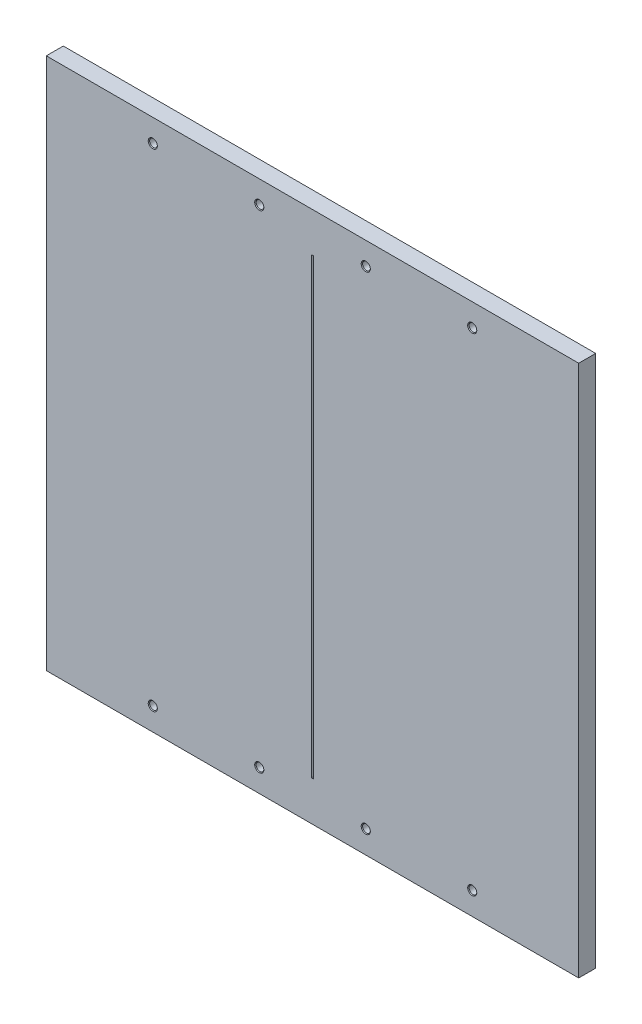
ISO-10303-21;
HEADER;
FILE_DESCRIPTION(('STEP AP214'),'2;1');
FILE_NAME('part.step','',(''),(''),'','','');
FILE_SCHEMA(('AUTOMOTIVE_DESIGN { 1 0 10303 214 1 1 1 1 }'));
ENDSEC;
DATA;
#1=APPLICATION_CONTEXT('core data for automotive mechanical design processes');
#2=APPLICATION_PROTOCOL_DEFINITION('international standard','automotive_design',2000,#1);
#3=PRODUCT_CONTEXT('',#1,'mechanical');
#4=PRODUCT('Part','Part','',(#3));
#5=PRODUCT_RELATED_PRODUCT_CATEGORY('part','',(#4));
#6=PRODUCT_DEFINITION_FORMATION('','',#4);
#7=PRODUCT_DEFINITION_CONTEXT('part definition',#1,'design');
#8=PRODUCT_DEFINITION('design','',#6,#7);
#9=PRODUCT_DEFINITION_SHAPE('','',#8);
#10=(LENGTH_UNIT() NAMED_UNIT(*) SI_UNIT(.MILLI.,.METRE.));
#11=(NAMED_UNIT(*) PLANE_ANGLE_UNIT() SI_UNIT($,.RADIAN.));
#12=(NAMED_UNIT(*) SI_UNIT($,.STERADIAN.) SOLID_ANGLE_UNIT());
#13=UNCERTAINTY_MEASURE_WITH_UNIT(LENGTH_MEASURE(1.E-05),#10,'distance_accuracy_value','');
#14=(GEOMETRIC_REPRESENTATION_CONTEXT(3) GLOBAL_UNCERTAINTY_ASSIGNED_CONTEXT((#13)) GLOBAL_UNIT_ASSIGNED_CONTEXT((#10,
#11,#12)) REPRESENTATION_CONTEXT('',''));
#15=CARTESIAN_POINT('',(0.,0.,0.));
#16=DIRECTION('',(0.,0.,1.));
#17=DIRECTION('',(1.,0.,0.));
#18=AXIS2_PLACEMENT_3D('',#15,#16,#17);
#19=CARTESIAN_POINT('',(235.,-235.,15.));
#20=DIRECTION('',(-1.,0.,0.));
#21=DIRECTION('',(0.,0.,1.));
#22=AXIS2_PLACEMENT_3D('',#19,#20,#21);
#23=PLANE('',#22);
#24=DIRECTION('',(0.,1.,0.));
#25=VECTOR('',#24,1.);
#26=CARTESIAN_POINT('',(235.,-235.,0.));
#27=LINE('',#26,#25);
#28=CARTESIAN_POINT('',(235.,-235.,0.));
#29=VERTEX_POINT('',#28);
#30=CARTESIAN_POINT('',(235.,235.,0.));
#31=VERTEX_POINT('',#30);
#32=EDGE_CURVE('E218',#29,#31,#27,.T.);
#33=ORIENTED_EDGE('',*,*,#32,.T.);
#34=DIRECTION('',(0.,0.,-1.));
#35=VECTOR('',#34,1.);
#36=CARTESIAN_POINT('',(235.,235.,15.));
#37=LINE('',#36,#35);
#38=CARTESIAN_POINT('',(235.,235.,15.));
#39=VERTEX_POINT('',#38);
#40=EDGE_CURVE('E11',#39,#31,#37,.T.);
#41=ORIENTED_EDGE('',*,*,#40,.F.);
#42=DIRECTION('',(0.,1.,0.));
#43=VECTOR('',#42,1.);
#44=CARTESIAN_POINT('',(235.,-235.,15.));
#45=LINE('',#44,#43);
#46=CARTESIAN_POINT('',(235.,-235.,15.));
#47=VERTEX_POINT('',#46);
#48=EDGE_CURVE('E211',#47,#39,#45,.T.);
#49=ORIENTED_EDGE('',*,*,#48,.F.);
#50=DIRECTION('',(0.,0.,-1.));
#51=VECTOR('',#50,1.);
#52=CARTESIAN_POINT('',(235.,-235.,15.));
#53=LINE('',#52,#51);
#54=EDGE_CURVE('E217',#47,#29,#53,.T.);
#55=ORIENTED_EDGE('',*,*,#54,.T.);
#56=EDGE_LOOP('',(#33,#41,#49,#55));
#57=FACE_BOUND('',#56,.T.);
#58=ADVANCED_FACE('F43',(#57),#23,.F.);
#59=CARTESIAN_POINT('',(-235.,235.,15.));
#60=DIRECTION('',(0.,-1.,0.));
#61=DIRECTION('',(0.,0.,-1.));
#62=AXIS2_PLACEMENT_3D('',#59,#60,#61);
#63=PLANE('',#62);
#64=DIRECTION('',(-1.,0.,0.));
#65=VECTOR('',#64,1.);
#66=CARTESIAN_POINT('',(-235.,235.,0.));
#67=LINE('',#66,#65);
#68=CARTESIAN_POINT('',(-235.,235.,0.));
#69=VERTEX_POINT('',#68);
#70=EDGE_CURVE('E221',#31,#69,#67,.T.);
#71=ORIENTED_EDGE('',*,*,#70,.T.);
#72=DIRECTION('',(0.,0.,-1.));
#73=VECTOR('',#72,1.);
#74=CARTESIAN_POINT('',(-235.,235.,15.));
#75=LINE('',#74,#73);
#76=CARTESIAN_POINT('',(-235.,235.,15.));
#77=VERTEX_POINT('',#76);
#78=EDGE_CURVE('E51',#77,#69,#75,.T.);
#79=ORIENTED_EDGE('',*,*,#78,.F.);
#80=DIRECTION('',(-1.,0.,0.));
#81=VECTOR('',#80,1.);
#82=CARTESIAN_POINT('',(-235.,235.,15.));
#83=LINE('',#82,#81);
#84=EDGE_CURVE('E96',#39,#77,#83,.T.);
#85=ORIENTED_EDGE('',*,*,#84,.F.);
#86=ORIENTED_EDGE('',*,*,#40,.T.);
#87=EDGE_LOOP('',(#71,#79,#85,#86));
#88=FACE_BOUND('',#87,.T.);
#89=ADVANCED_FACE('F277',(#88),#63,.F.);
#90=CARTESIAN_POINT('',(-235.,-235.,15.));
#91=DIRECTION('',(1.,0.,0.));
#92=DIRECTION('',(0.,0.,-1.));
#93=AXIS2_PLACEMENT_3D('',#90,#91,#92);
#94=PLANE('',#93);
#95=DIRECTION('',(0.,-1.,0.));
#96=VECTOR('',#95,1.);
#97=CARTESIAN_POINT('',(-235.,-235.,0.));
#98=LINE('',#97,#96);
#99=CARTESIAN_POINT('',(-235.,-235.,0.));
#100=VERTEX_POINT('',#99);
#101=EDGE_CURVE('E223',#69,#100,#98,.T.);
#102=ORIENTED_EDGE('',*,*,#101,.T.);
#103=DIRECTION('',(0.,0.,-1.));
#104=VECTOR('',#103,1.);
#105=CARTESIAN_POINT('',(-235.,-235.,15.));
#106=LINE('',#105,#104);
#107=CARTESIAN_POINT('',(-235.,-235.,15.));
#108=VERTEX_POINT('',#107);
#109=EDGE_CURVE('E227',#108,#100,#106,.T.);
#110=ORIENTED_EDGE('',*,*,#109,.F.);
#111=DIRECTION('',(0.,-1.,0.));
#112=VECTOR('',#111,1.);
#113=CARTESIAN_POINT('',(-235.,-235.,15.));
#114=LINE('',#113,#112);
#115=EDGE_CURVE('E214',#77,#108,#114,.T.);
#116=ORIENTED_EDGE('',*,*,#115,.F.);
#117=ORIENTED_EDGE('',*,*,#78,.T.);
#118=EDGE_LOOP('',(#102,#110,#116,#117));
#119=FACE_BOUND('',#118,.T.);
#120=ADVANCED_FACE('F276',(#119),#94,.F.);
#121=CARTESIAN_POINT('',(-235.,-235.,15.));
#122=DIRECTION('',(0.,1.,0.));
#123=DIRECTION('',(0.,0.,1.));
#124=AXIS2_PLACEMENT_3D('',#121,#122,#123);
#125=PLANE('',#124);
#126=DIRECTION('',(1.,0.,0.));
#127=VECTOR('',#126,1.);
#128=CARTESIAN_POINT('',(-235.,-235.,0.));
#129=LINE('',#128,#127);
#130=EDGE_CURVE('E89',#100,#29,#129,.T.);
#131=ORIENTED_EDGE('',*,*,#130,.T.);
#132=ORIENTED_EDGE('',*,*,#54,.F.);
#133=DIRECTION('',(1.,0.,0.));
#134=VECTOR('',#133,1.);
#135=CARTESIAN_POINT('',(-235.,-235.,15.));
#136=LINE('',#135,#134);
#137=EDGE_CURVE('E68',#108,#47,#136,.T.);
#138=ORIENTED_EDGE('',*,*,#137,.F.);
#139=ORIENTED_EDGE('',*,*,#109,.T.);
#140=EDGE_LOOP('',(#131,#132,#138,#139));
#141=FACE_BOUND('',#140,.T.);
#142=ADVANCED_FACE('F272',(#141),#125,.F.);
#143=CARTESIAN_POINT('',(0.,0.,15.));
#144=DIRECTION('',(0.,0.,-1.));
#145=DIRECTION('',(-1.,0.,0.));
#146=AXIS2_PLACEMENT_3D('',#143,#144,#145);
#147=PLANE('',#146);
#148=DIRECTION('',(-1.,0.,0.));
#149=VECTOR('',#148,1.);
#150=CARTESIAN_POINT('',(-1.00000000000002,200.,15.));
#151=LINE('',#150,#149);
#152=CARTESIAN_POINT('',(0.999999999999976,200.,15.));
#153=VERTEX_POINT('',#152);
#154=CARTESIAN_POINT('',(-1.00000000000002,200.,15.));
#155=VERTEX_POINT('',#154);
#156=EDGE_CURVE('E147',#153,#155,#151,.T.);
#157=ORIENTED_EDGE('',*,*,#156,.F.);
#158=DIRECTION('',(0.,1.,0.));
#159=VECTOR('',#158,1.);
#160=CARTESIAN_POINT('',(0.999999999999976,200.,15.));
#161=LINE('',#160,#159);
#162=CARTESIAN_POINT('',(1.00000000000002,-200.,15.));
#163=VERTEX_POINT('',#162);
#164=EDGE_CURVE('E59',#163,#153,#161,.T.);
#165=ORIENTED_EDGE('',*,*,#164,.F.);
#166=DIRECTION('',(1.,0.,0.));
#167=VECTOR('',#166,1.);
#168=CARTESIAN_POINT('',(-0.999999999999975,-200.,15.));
#169=LINE('',#168,#167);
#170=CARTESIAN_POINT('',(-0.999999999999975,-200.,15.));
#171=VERTEX_POINT('',#170);
#172=EDGE_CURVE('E138',#171,#163,#169,.T.);
#173=ORIENTED_EDGE('',*,*,#172,.F.);
#174=DIRECTION('',(0.,-1.,0.));
#175=VECTOR('',#174,1.);
#176=CARTESIAN_POINT('',(-1.00000000000002,200.,15.));
#177=LINE('',#176,#175);
#178=EDGE_CURVE('E141',#155,#171,#177,.T.);
#179=ORIENTED_EDGE('',*,*,#178,.F.);
#180=EDGE_LOOP('',(#157,#165,#173,#179));
#181=FACE_BOUND('',#180,.T.);
#182=CARTESIAN_POINT('',(-141.,215.,15.));
#183=DIRECTION('',(0.,0.,1.));
#184=DIRECTION('',(1.,0.,0.));
#185=AXIS2_PLACEMENT_3D('',#182,#183,#184);
#186=CIRCLE('',#185,4.025);
#187=CARTESIAN_POINT('',(-136.975,215.,15.));
#188=VERTEX_POINT('',#187);
#189=EDGE_CURVE('E153',#188,#188,#186,.T.);
#190=ORIENTED_EDGE('',*,*,#189,.F.);
#191=EDGE_LOOP('',(#190));
#192=FACE_BOUND('',#191,.T.);
#193=CARTESIAN_POINT('',(-46.9999999999999,215.,15.));
#194=DIRECTION('',(0.,0.,1.));
#195=DIRECTION('',(1.,0.,0.));
#196=AXIS2_PLACEMENT_3D('',#193,#194,#195);
#197=CIRCLE('',#196,4.025);
#198=CARTESIAN_POINT('',(-42.9749999999999,215.,15.));
#199=VERTEX_POINT('',#198);
#200=EDGE_CURVE('E162',#199,#199,#197,.T.);
#201=ORIENTED_EDGE('',*,*,#200,.F.);
#202=EDGE_LOOP('',(#201));
#203=FACE_BOUND('',#202,.T.);
#204=CARTESIAN_POINT('',(47.0000000000001,215.,15.));
#205=DIRECTION('',(0.,0.,1.));
#206=DIRECTION('',(1.,0.,0.));
#207=AXIS2_PLACEMENT_3D('',#204,#205,#206);
#208=CIRCLE('',#207,4.025);
#209=CARTESIAN_POINT('',(51.0250000000001,215.,15.));
#210=VERTEX_POINT('',#209);
#211=EDGE_CURVE('E169',#210,#210,#208,.T.);
#212=ORIENTED_EDGE('',*,*,#211,.F.);
#213=EDGE_LOOP('',(#212));
#214=FACE_BOUND('',#213,.T.);
#215=CARTESIAN_POINT('',(141.,215.,15.));
#216=DIRECTION('',(0.,0.,1.));
#217=DIRECTION('',(1.,0.,0.));
#218=AXIS2_PLACEMENT_3D('',#215,#216,#217);
#219=CIRCLE('',#218,4.025);
#220=CARTESIAN_POINT('',(145.025,215.,15.));
#221=VERTEX_POINT('',#220);
#222=EDGE_CURVE('E176',#221,#221,#219,.T.);
#223=ORIENTED_EDGE('',*,*,#222,.F.);
#224=EDGE_LOOP('',(#223));
#225=FACE_BOUND('',#224,.T.);
#226=CARTESIAN_POINT('',(-141.,-215.,15.));
#227=DIRECTION('',(0.,0.,1.));
#228=DIRECTION('',(1.,0.,0.));
#229=AXIS2_PLACEMENT_3D('',#226,#227,#228);
#230=CIRCLE('',#229,4.025);
#231=CARTESIAN_POINT('',(-136.975,-215.,15.));
#232=VERTEX_POINT('',#231);
#233=EDGE_CURVE('E183',#232,#232,#230,.T.);
#234=ORIENTED_EDGE('',*,*,#233,.F.);
#235=EDGE_LOOP('',(#234));
#236=FACE_BOUND('',#235,.T.);
#237=CARTESIAN_POINT('',(-46.9999999999999,-215.,15.));
#238=DIRECTION('',(0.,0.,1.));
#239=DIRECTION('',(1.,0.,0.));
#240=AXIS2_PLACEMENT_3D('',#237,#238,#239);
#241=CIRCLE('',#240,4.025);
#242=CARTESIAN_POINT('',(-42.9749999999998,-215.,15.));
#243=VERTEX_POINT('',#242);
#244=EDGE_CURVE('E190',#243,#243,#241,.T.);
#245=ORIENTED_EDGE('',*,*,#244,.F.);
#246=EDGE_LOOP('',(#245));
#247=FACE_BOUND('',#246,.T.);
#248=CARTESIAN_POINT('',(141.,-215.,15.));
#249=DIRECTION('',(0.,0.,1.));
#250=DIRECTION('',(1.,0.,0.));
#251=AXIS2_PLACEMENT_3D('',#248,#249,#250);
#252=CIRCLE('',#251,4.025);
#253=CARTESIAN_POINT('',(145.025,-215.,15.));
#254=VERTEX_POINT('',#253);
#255=EDGE_CURVE('E197',#254,#254,#252,.T.);
#256=ORIENTED_EDGE('',*,*,#255,.F.);
#257=EDGE_LOOP('',(#256));
#258=FACE_BOUND('',#257,.T.);
#259=CARTESIAN_POINT('',(47.0000000000001,-215.,15.));
#260=DIRECTION('',(0.,0.,1.));
#261=DIRECTION('',(1.,0.,0.));
#262=AXIS2_PLACEMENT_3D('',#259,#260,#261);
#263=CIRCLE('',#262,4.025);
#264=CARTESIAN_POINT('',(51.0250000000001,-215.,15.));
#265=VERTEX_POINT('',#264);
#266=EDGE_CURVE('E204',#265,#265,#263,.T.);
#267=ORIENTED_EDGE('',*,*,#266,.F.);
#268=EDGE_LOOP('',(#267));
#269=FACE_BOUND('',#268,.T.);
#270=ORIENTED_EDGE('',*,*,#48,.T.);
#271=ORIENTED_EDGE('',*,*,#84,.T.);
#272=ORIENTED_EDGE('',*,*,#115,.T.);
#273=ORIENTED_EDGE('',*,*,#137,.T.);
#274=EDGE_LOOP('',(#270,#271,#272,#273));
#275=FACE_BOUND('',#274,.T.);
#276=ADVANCED_FACE('F252',(#181,#192,#203,#214,#225,#236,#247,#258,#269,#275),#147,.F.);
#277=CARTESIAN_POINT('',(0.,0.,0.));
#278=DIRECTION('',(0.,0.,-1.));
#279=DIRECTION('',(-1.,0.,0.));
#280=AXIS2_PLACEMENT_3D('',#277,#278,#279);
#281=PLANE('',#280);
#282=CARTESIAN_POINT('',(-141.,215.,0.));
#283=DIRECTION('',(0.,0.,-1.));
#284=DIRECTION('',(-1.,0.,0.));
#285=AXIS2_PLACEMENT_3D('',#282,#283,#284);
#286=CIRCLE('',#285,3.39999999999999);
#287=CARTESIAN_POINT('',(-144.4,215.,0.));
#288=VERTEX_POINT('',#287);
#289=EDGE_CURVE('E46',#288,#288,#286,.T.);
#290=ORIENTED_EDGE('',*,*,#289,.F.);
#291=EDGE_LOOP('',(#290));
#292=FACE_BOUND('',#291,.T.);
#293=CARTESIAN_POINT('',(-46.9999999999999,215.,0.));
#294=DIRECTION('',(0.,0.,-1.));
#295=DIRECTION('',(-1.,0.,0.));
#296=AXIS2_PLACEMENT_3D('',#293,#294,#295);
#297=CIRCLE('',#296,3.4);
#298=CARTESIAN_POINT('',(-50.3999999999999,215.,0.));
#299=VERTEX_POINT('',#298);
#300=EDGE_CURVE('E168',#299,#299,#297,.T.);
#301=ORIENTED_EDGE('',*,*,#300,.F.);
#302=EDGE_LOOP('',(#301));
#303=FACE_BOUND('',#302,.T.);
#304=CARTESIAN_POINT('',(47.0000000000001,215.,0.));
#305=DIRECTION('',(0.,0.,-1.));
#306=DIRECTION('',(-1.,0.,0.));
#307=AXIS2_PLACEMENT_3D('',#304,#305,#306);
#308=CIRCLE('',#307,3.4);
#309=CARTESIAN_POINT('',(43.6000000000001,215.,0.));
#310=VERTEX_POINT('',#309);
#311=EDGE_CURVE('E175',#310,#310,#308,.T.);
#312=ORIENTED_EDGE('',*,*,#311,.F.);
#313=EDGE_LOOP('',(#312));
#314=FACE_BOUND('',#313,.T.);
#315=CARTESIAN_POINT('',(141.,215.,0.));
#316=DIRECTION('',(0.,0.,-1.));
#317=DIRECTION('',(-1.,0.,0.));
#318=AXIS2_PLACEMENT_3D('',#315,#316,#317);
#319=CIRCLE('',#318,3.39999999999999);
#320=CARTESIAN_POINT('',(137.6,215.,0.));
#321=VERTEX_POINT('',#320);
#322=EDGE_CURVE('E182',#321,#321,#319,.T.);
#323=ORIENTED_EDGE('',*,*,#322,.F.);
#324=EDGE_LOOP('',(#323));
#325=FACE_BOUND('',#324,.T.);
#326=CARTESIAN_POINT('',(-141.,-215.,0.));
#327=DIRECTION('',(0.,0.,-1.));
#328=DIRECTION('',(-1.,0.,0.));
#329=AXIS2_PLACEMENT_3D('',#326,#327,#328);
#330=CIRCLE('',#329,3.39999999999999);
#331=CARTESIAN_POINT('',(-144.4,-215.,0.));
#332=VERTEX_POINT('',#331);
#333=EDGE_CURVE('E189',#332,#332,#330,.T.);
#334=ORIENTED_EDGE('',*,*,#333,.F.);
#335=EDGE_LOOP('',(#334));
#336=FACE_BOUND('',#335,.T.);
#337=CARTESIAN_POINT('',(-46.9999999999999,-215.,0.));
#338=DIRECTION('',(0.,0.,-1.));
#339=DIRECTION('',(-1.,0.,0.));
#340=AXIS2_PLACEMENT_3D('',#337,#338,#339);
#341=CIRCLE('',#340,3.4);
#342=CARTESIAN_POINT('',(-50.3999999999998,-215.,0.));
#343=VERTEX_POINT('',#342);
#344=EDGE_CURVE('E196',#343,#343,#341,.T.);
#345=ORIENTED_EDGE('',*,*,#344,.F.);
#346=EDGE_LOOP('',(#345));
#347=FACE_BOUND('',#346,.T.);
#348=CARTESIAN_POINT('',(141.,-215.,0.));
#349=DIRECTION('',(0.,0.,-1.));
#350=DIRECTION('',(-1.,0.,0.));
#351=AXIS2_PLACEMENT_3D('',#348,#349,#350);
#352=CIRCLE('',#351,3.39999999999999);
#353=CARTESIAN_POINT('',(137.6,-215.,0.));
#354=VERTEX_POINT('',#353);
#355=EDGE_CURVE('E203',#354,#354,#352,.T.);
#356=ORIENTED_EDGE('',*,*,#355,.F.);
#357=EDGE_LOOP('',(#356));
#358=FACE_BOUND('',#357,.T.);
#359=CARTESIAN_POINT('',(47.0000000000001,-215.,0.));
#360=DIRECTION('',(0.,0.,-1.));
#361=DIRECTION('',(-1.,0.,0.));
#362=AXIS2_PLACEMENT_3D('',#359,#360,#361);
#363=CIRCLE('',#362,3.4);
#364=CARTESIAN_POINT('',(43.6000000000001,-215.,0.));
#365=VERTEX_POINT('',#364);
#366=EDGE_CURVE('E210',#365,#365,#363,.T.);
#367=ORIENTED_EDGE('',*,*,#366,.F.);
#368=EDGE_LOOP('',(#367));
#369=FACE_BOUND('',#368,.T.);
#370=ORIENTED_EDGE('',*,*,#32,.F.);
#371=ORIENTED_EDGE('',*,*,#130,.F.);
#372=ORIENTED_EDGE('',*,*,#101,.F.);
#373=ORIENTED_EDGE('',*,*,#70,.F.);
#374=EDGE_LOOP('',(#370,#371,#372,#373));
#375=FACE_BOUND('',#374,.T.);
#376=ADVANCED_FACE('F248',(#292,#303,#314,#325,#336,#347,#358,#369,#375),#281,.T.);
#377=CARTESIAN_POINT('',(47.0000000000001,-215.,15.));
#378=DIRECTION('',(0.,0.,1.));
#379=DIRECTION('',(1.,0.,0.));
#380=AXIS2_PLACEMENT_3D('',#377,#378,#379);
#381=CYLINDRICAL_SURFACE('',#380,3.4);
#382=ORIENTED_EDGE('',*,*,#366,.T.);
#383=EDGE_LOOP('',(#382));
#384=FACE_BOUND('',#383,.T.);
#385=CARTESIAN_POINT('',(47.0000000000001,-215.,14.375));
#386=DIRECTION('',(0.,0.,1.));
#387=DIRECTION('',(1.,0.,0.));
#388=AXIS2_PLACEMENT_3D('',#385,#386,#387);
#389=CIRCLE('',#388,3.4);
#390=CARTESIAN_POINT('',(50.4000000000001,-215.,14.375));
#391=VERTEX_POINT('',#390);
#392=EDGE_CURVE('E207',#391,#391,#389,.T.);
#393=ORIENTED_EDGE('',*,*,#392,.T.);
#394=EDGE_LOOP('',(#393));
#395=FACE_BOUND('',#394,.T.);
#396=ADVANCED_FACE('F251',(#384,#395),#381,.F.);
#397=CARTESIAN_POINT('',(47.0000000000001,-215.,15.));
#398=DIRECTION('',(0.,0.,1.));
#399=DIRECTION('',(1.,0.,0.));
#400=AXIS2_PLACEMENT_3D('',#397,#398,#399);
#401=CONICAL_SURFACE('',#400,4.025,0.785398163397446);
#402=ORIENTED_EDGE('',*,*,#392,.F.);
#403=EDGE_LOOP('',(#402));
#404=FACE_BOUND('',#403,.T.);
#405=ORIENTED_EDGE('',*,*,#266,.T.);
#406=EDGE_LOOP('',(#405));
#407=FACE_BOUND('',#406,.T.);
#408=ADVANCED_FACE('F292',(#404,#407),#401,.F.);
#409=CARTESIAN_POINT('',(141.,-215.,15.));
#410=DIRECTION('',(0.,0.,1.));
#411=DIRECTION('',(1.,0.,0.));
#412=AXIS2_PLACEMENT_3D('',#409,#410,#411);
#413=CYLINDRICAL_SURFACE('',#412,3.39999999999999);
#414=ORIENTED_EDGE('',*,*,#355,.T.);
#415=EDGE_LOOP('',(#414));
#416=FACE_BOUND('',#415,.T.);
#417=CARTESIAN_POINT('',(141.,-215.,14.375));
#418=DIRECTION('',(0.,0.,1.));
#419=DIRECTION('',(1.,0.,0.));
#420=AXIS2_PLACEMENT_3D('',#417,#418,#419);
#421=CIRCLE('',#420,3.39999999999999);
#422=CARTESIAN_POINT('',(144.4,-215.,14.375));
#423=VERTEX_POINT('',#422);
#424=EDGE_CURVE('E200',#423,#423,#421,.T.);
#425=ORIENTED_EDGE('',*,*,#424,.T.);
#426=EDGE_LOOP('',(#425));
#427=FACE_BOUND('',#426,.T.);
#428=ADVANCED_FACE('F296',(#416,#427),#413,.F.);
#429=CARTESIAN_POINT('',(141.,-215.,15.));
#430=DIRECTION('',(0.,0.,1.));
#431=DIRECTION('',(1.,0.,0.));
#432=AXIS2_PLACEMENT_3D('',#429,#430,#431);
#433=CONICAL_SURFACE('',#432,4.025,0.785398163397457);
#434=ORIENTED_EDGE('',*,*,#424,.F.);
#435=EDGE_LOOP('',(#434));
#436=FACE_BOUND('',#435,.T.);
#437=ORIENTED_EDGE('',*,*,#255,.T.);
#438=EDGE_LOOP('',(#437));
#439=FACE_BOUND('',#438,.T.);
#440=ADVANCED_FACE('F300',(#436,#439),#433,.F.);
#441=CARTESIAN_POINT('',(-46.9999999999999,-215.,15.));
#442=DIRECTION('',(0.,0.,1.));
#443=DIRECTION('',(1.,0.,0.));
#444=AXIS2_PLACEMENT_3D('',#441,#442,#443);
#445=CYLINDRICAL_SURFACE('',#444,3.4);
#446=ORIENTED_EDGE('',*,*,#344,.T.);
#447=EDGE_LOOP('',(#446));
#448=FACE_BOUND('',#447,.T.);
#449=CARTESIAN_POINT('',(-46.9999999999999,-215.,14.375));
#450=DIRECTION('',(0.,0.,1.));
#451=DIRECTION('',(1.,0.,0.));
#452=AXIS2_PLACEMENT_3D('',#449,#450,#451);
#453=CIRCLE('',#452,3.4);
#454=CARTESIAN_POINT('',(-43.5999999999998,-215.,14.375));
#455=VERTEX_POINT('',#454);
#456=EDGE_CURVE('E193',#455,#455,#453,.T.);
#457=ORIENTED_EDGE('',*,*,#456,.T.);
#458=EDGE_LOOP('',(#457));
#459=FACE_BOUND('',#458,.T.);
#460=ADVANCED_FACE('F304',(#448,#459),#445,.F.);
#461=CARTESIAN_POINT('',(-46.9999999999999,-215.,15.));
#462=DIRECTION('',(0.,0.,1.));
#463=DIRECTION('',(1.,0.,0.));
#464=AXIS2_PLACEMENT_3D('',#461,#462,#463);
#465=CONICAL_SURFACE('',#464,4.025,0.785398163397446);
#466=ORIENTED_EDGE('',*,*,#456,.F.);
#467=EDGE_LOOP('',(#466));
#468=FACE_BOUND('',#467,.T.);
#469=ORIENTED_EDGE('',*,*,#244,.T.);
#470=EDGE_LOOP('',(#469));
#471=FACE_BOUND('',#470,.T.);
#472=ADVANCED_FACE('F308',(#468,#471),#465,.F.);
#473=CARTESIAN_POINT('',(-141.,-215.,15.));
#474=DIRECTION('',(0.,0.,1.));
#475=DIRECTION('',(1.,0.,0.));
#476=AXIS2_PLACEMENT_3D('',#473,#474,#475);
#477=CYLINDRICAL_SURFACE('',#476,3.39999999999999);
#478=ORIENTED_EDGE('',*,*,#333,.T.);
#479=EDGE_LOOP('',(#478));
#480=FACE_BOUND('',#479,.T.);
#481=CARTESIAN_POINT('',(-141.,-215.,14.375));
#482=DIRECTION('',(0.,0.,1.));
#483=DIRECTION('',(1.,0.,0.));
#484=AXIS2_PLACEMENT_3D('',#481,#482,#483);
#485=CIRCLE('',#484,3.39999999999999);
#486=CARTESIAN_POINT('',(-137.6,-215.,14.375));
#487=VERTEX_POINT('',#486);
#488=EDGE_CURVE('E186',#487,#487,#485,.T.);
#489=ORIENTED_EDGE('',*,*,#488,.T.);
#490=EDGE_LOOP('',(#489));
#491=FACE_BOUND('',#490,.T.);
#492=ADVANCED_FACE('F312',(#480,#491),#477,.F.);
#493=CARTESIAN_POINT('',(-141.,-215.,15.));
#494=DIRECTION('',(0.,0.,1.));
#495=DIRECTION('',(1.,0.,0.));
#496=AXIS2_PLACEMENT_3D('',#493,#494,#495);
#497=CONICAL_SURFACE('',#496,4.025,0.785398163397457);
#498=ORIENTED_EDGE('',*,*,#488,.F.);
#499=EDGE_LOOP('',(#498));
#500=FACE_BOUND('',#499,.T.);
#501=ORIENTED_EDGE('',*,*,#233,.T.);
#502=EDGE_LOOP('',(#501));
#503=FACE_BOUND('',#502,.T.);
#504=ADVANCED_FACE('F316',(#500,#503),#497,.F.);
#505=CARTESIAN_POINT('',(141.,215.,15.));
#506=DIRECTION('',(0.,0.,1.));
#507=DIRECTION('',(1.,0.,0.));
#508=AXIS2_PLACEMENT_3D('',#505,#506,#507);
#509=CYLINDRICAL_SURFACE('',#508,3.39999999999999);
#510=ORIENTED_EDGE('',*,*,#322,.T.);
#511=EDGE_LOOP('',(#510));
#512=FACE_BOUND('',#511,.T.);
#513=CARTESIAN_POINT('',(141.,215.,14.375));
#514=DIRECTION('',(0.,0.,1.));
#515=DIRECTION('',(1.,0.,0.));
#516=AXIS2_PLACEMENT_3D('',#513,#514,#515);
#517=CIRCLE('',#516,3.39999999999999);
#518=CARTESIAN_POINT('',(144.4,215.,14.375));
#519=VERTEX_POINT('',#518);
#520=EDGE_CURVE('E179',#519,#519,#517,.T.);
#521=ORIENTED_EDGE('',*,*,#520,.T.);
#522=EDGE_LOOP('',(#521));
#523=FACE_BOUND('',#522,.T.);
#524=ADVANCED_FACE('F320',(#512,#523),#509,.F.);
#525=CARTESIAN_POINT('',(141.,215.,15.));
#526=DIRECTION('',(0.,0.,1.));
#527=DIRECTION('',(1.,0.,0.));
#528=AXIS2_PLACEMENT_3D('',#525,#526,#527);
#529=CONICAL_SURFACE('',#528,4.025,0.785398163397457);
#530=ORIENTED_EDGE('',*,*,#520,.F.);
#531=EDGE_LOOP('',(#530));
#532=FACE_BOUND('',#531,.T.);
#533=ORIENTED_EDGE('',*,*,#222,.T.);
#534=EDGE_LOOP('',(#533));
#535=FACE_BOUND('',#534,.T.);
#536=ADVANCED_FACE('F324',(#532,#535),#529,.F.);
#537=CARTESIAN_POINT('',(47.0000000000001,215.,15.));
#538=DIRECTION('',(0.,0.,1.));
#539=DIRECTION('',(1.,0.,0.));
#540=AXIS2_PLACEMENT_3D('',#537,#538,#539);
#541=CYLINDRICAL_SURFACE('',#540,3.4);
#542=ORIENTED_EDGE('',*,*,#311,.T.);
#543=EDGE_LOOP('',(#542));
#544=FACE_BOUND('',#543,.T.);
#545=CARTESIAN_POINT('',(47.0000000000001,215.,14.375));
#546=DIRECTION('',(0.,0.,1.));
#547=DIRECTION('',(1.,0.,0.));
#548=AXIS2_PLACEMENT_3D('',#545,#546,#547);
#549=CIRCLE('',#548,3.4);
#550=CARTESIAN_POINT('',(50.4000000000001,215.,14.375));
#551=VERTEX_POINT('',#550);
#552=EDGE_CURVE('E172',#551,#551,#549,.T.);
#553=ORIENTED_EDGE('',*,*,#552,.T.);
#554=EDGE_LOOP('',(#553));
#555=FACE_BOUND('',#554,.T.);
#556=ADVANCED_FACE('F328',(#544,#555),#541,.F.);
#557=CARTESIAN_POINT('',(47.0000000000001,215.,15.));
#558=DIRECTION('',(0.,0.,1.));
#559=DIRECTION('',(1.,0.,0.));
#560=AXIS2_PLACEMENT_3D('',#557,#558,#559);
#561=CONICAL_SURFACE('',#560,4.025,0.785398163397446);
#562=ORIENTED_EDGE('',*,*,#552,.F.);
#563=EDGE_LOOP('',(#562));
#564=FACE_BOUND('',#563,.T.);
#565=ORIENTED_EDGE('',*,*,#211,.T.);
#566=EDGE_LOOP('',(#565));
#567=FACE_BOUND('',#566,.T.);
#568=ADVANCED_FACE('F332',(#564,#567),#561,.F.);
#569=CARTESIAN_POINT('',(-46.9999999999999,215.,15.));
#570=DIRECTION('',(0.,0.,1.));
#571=DIRECTION('',(1.,0.,0.));
#572=AXIS2_PLACEMENT_3D('',#569,#570,#571);
#573=CYLINDRICAL_SURFACE('',#572,3.4);
#574=ORIENTED_EDGE('',*,*,#300,.T.);
#575=EDGE_LOOP('',(#574));
#576=FACE_BOUND('',#575,.T.);
#577=CARTESIAN_POINT('',(-46.9999999999999,215.,14.375));
#578=DIRECTION('',(0.,0.,1.));
#579=DIRECTION('',(1.,0.,0.));
#580=AXIS2_PLACEMENT_3D('',#577,#578,#579);
#581=CIRCLE('',#580,3.4);
#582=CARTESIAN_POINT('',(-43.5999999999999,215.,14.375));
#583=VERTEX_POINT('',#582);
#584=EDGE_CURVE('E165',#583,#583,#581,.T.);
#585=ORIENTED_EDGE('',*,*,#584,.T.);
#586=EDGE_LOOP('',(#585));
#587=FACE_BOUND('',#586,.T.);
#588=ADVANCED_FACE('F245',(#576,#587),#573,.F.);
#589=CARTESIAN_POINT('',(-46.9999999999999,215.,15.));
#590=DIRECTION('',(0.,0.,1.));
#591=DIRECTION('',(1.,0.,0.));
#592=AXIS2_PLACEMENT_3D('',#589,#590,#591);
#593=CONICAL_SURFACE('',#592,4.025,0.785398163397446);
#594=ORIENTED_EDGE('',*,*,#584,.F.);
#595=EDGE_LOOP('',(#594));
#596=FACE_BOUND('',#595,.T.);
#597=ORIENTED_EDGE('',*,*,#200,.T.);
#598=EDGE_LOOP('',(#597));
#599=FACE_BOUND('',#598,.T.);
#600=ADVANCED_FACE('F339',(#596,#599),#593,.F.);
#601=CARTESIAN_POINT('',(-141.,215.,15.));
#602=DIRECTION('',(0.,0.,1.));
#603=DIRECTION('',(1.,0.,0.));
#604=AXIS2_PLACEMENT_3D('',#601,#602,#603);
#605=CYLINDRICAL_SURFACE('',#604,3.39999999999999);
#606=ORIENTED_EDGE('',*,*,#289,.T.);
#607=EDGE_LOOP('',(#606));
#608=FACE_BOUND('',#607,.T.);
#609=CARTESIAN_POINT('',(-141.,215.,14.375));
#610=DIRECTION('',(0.,0.,1.));
#611=DIRECTION('',(1.,0.,0.));
#612=AXIS2_PLACEMENT_3D('',#609,#610,#611);
#613=CIRCLE('',#612,3.39999999999999);
#614=CARTESIAN_POINT('',(-137.6,215.,14.375));
#615=VERTEX_POINT('',#614);
#616=EDGE_CURVE('E159',#615,#615,#613,.T.);
#617=ORIENTED_EDGE('',*,*,#616,.T.);
#618=EDGE_LOOP('',(#617));
#619=FACE_BOUND('',#618,.T.);
#620=ADVANCED_FACE('F342',(#608,#619),#605,.F.);
#621=CARTESIAN_POINT('',(-141.,215.,15.));
#622=DIRECTION('',(0.,0.,1.));
#623=DIRECTION('',(1.,0.,0.));
#624=AXIS2_PLACEMENT_3D('',#621,#622,#623);
#625=CONICAL_SURFACE('',#624,4.025,0.785398163397457);
#626=ORIENTED_EDGE('',*,*,#616,.F.);
#627=EDGE_LOOP('',(#626));
#628=FACE_BOUND('',#627,.T.);
#629=ORIENTED_EDGE('',*,*,#189,.T.);
#630=EDGE_LOOP('',(#629));
#631=FACE_BOUND('',#630,.T.);
#632=ADVANCED_FACE('F346',(#628,#631),#625,.F.);
#633=CARTESIAN_POINT('',(0.999999999999976,200.,10.));
#634=DIRECTION('',(1.,0.,0.));
#635=DIRECTION('',(0.,1.,0.));
#636=AXIS2_PLACEMENT_3D('',#633,#634,#635);
#637=PLANE('',#636);
#638=ORIENTED_EDGE('',*,*,#164,.T.);
#639=DIRECTION('',(0.,0.,1.));
#640=VECTOR('',#639,1.);
#641=CARTESIAN_POINT('',(0.999999999999976,200.,10.));
#642=LINE('',#641,#640);
#643=CARTESIAN_POINT('',(0.999999999999976,200.,10.));
#644=VERTEX_POINT('',#643);
#645=EDGE_CURVE('E116',#644,#153,#642,.T.);
#646=ORIENTED_EDGE('',*,*,#645,.F.);
#647=DIRECTION('',(0.,1.,0.));
#648=VECTOR('',#647,1.);
#649=CARTESIAN_POINT('',(0.999999999999976,200.,10.));
#650=LINE('',#649,#648);
#651=CARTESIAN_POINT('',(1.00000000000002,-200.,10.));
#652=VERTEX_POINT('',#651);
#653=EDGE_CURVE('E120',#652,#644,#650,.T.);
#654=ORIENTED_EDGE('',*,*,#653,.F.);
#655=DIRECTION('',(0.,0.,1.));
#656=VECTOR('',#655,1.);
#657=CARTESIAN_POINT('',(1.00000000000002,-200.,10.));
#658=LINE('',#657,#656);
#659=EDGE_CURVE('E151',#652,#163,#658,.T.);
#660=ORIENTED_EDGE('',*,*,#659,.T.);
#661=EDGE_LOOP('',(#638,#646,#654,#660));
#662=FACE_BOUND('',#661,.T.);
#663=ADVANCED_FACE('F118',(#662),#637,.F.);
#664=CARTESIAN_POINT('',(-0.999999999999975,-200.,10.));
#665=DIRECTION('',(0.,-1.,0.));
#666=DIRECTION('',(0.,0.,-1.));
#667=AXIS2_PLACEMENT_3D('',#664,#665,#666);
#668=PLANE('',#667);
#669=ORIENTED_EDGE('',*,*,#172,.T.);
#670=ORIENTED_EDGE('',*,*,#659,.F.);
#671=DIRECTION('',(1.,0.,0.));
#672=VECTOR('',#671,1.);
#673=CARTESIAN_POINT('',(-0.999999999999975,-200.,10.));
#674=LINE('',#673,#672);
#675=CARTESIAN_POINT('',(-0.999999999999975,-200.,10.));
#676=VERTEX_POINT('',#675);
#677=EDGE_CURVE('E126',#676,#652,#674,.T.);
#678=ORIENTED_EDGE('',*,*,#677,.F.);
#679=DIRECTION('',(0.,0.,1.));
#680=VECTOR('',#679,1.);
#681=CARTESIAN_POINT('',(-0.999999999999975,-200.,10.));
#682=LINE('',#681,#680);
#683=EDGE_CURVE('E154',#676,#171,#682,.T.);
#684=ORIENTED_EDGE('',*,*,#683,.T.);
#685=EDGE_LOOP('',(#669,#670,#678,#684));
#686=FACE_BOUND('',#685,.T.);
#687=ADVANCED_FACE('F353',(#686),#668,.F.);
#688=CARTESIAN_POINT('',(-1.00000000000002,200.,10.));
#689=DIRECTION('',(-1.,0.,0.));
#690=DIRECTION('',(0.,-1.,0.));
#691=AXIS2_PLACEMENT_3D('',#688,#689,#690);
#692=PLANE('',#691);
#693=ORIENTED_EDGE('',*,*,#178,.T.);
#694=ORIENTED_EDGE('',*,*,#683,.F.);
#695=DIRECTION('',(0.,-1.,0.));
#696=VECTOR('',#695,1.);
#697=CARTESIAN_POINT('',(-1.00000000000002,200.,10.));
#698=LINE('',#697,#696);
#699=CARTESIAN_POINT('',(-1.00000000000002,200.,10.));
#700=VERTEX_POINT('',#699);
#701=EDGE_CURVE('E134',#700,#676,#698,.T.);
#702=ORIENTED_EDGE('',*,*,#701,.F.);
#703=DIRECTION('',(0.,0.,1.));
#704=VECTOR('',#703,1.);
#705=CARTESIAN_POINT('',(-1.00000000000002,200.,10.));
#706=LINE('',#705,#704);
#707=EDGE_CURVE('E125',#700,#155,#706,.T.);
#708=ORIENTED_EDGE('',*,*,#707,.T.);
#709=EDGE_LOOP('',(#693,#694,#702,#708));
#710=FACE_BOUND('',#709,.T.);
#711=ADVANCED_FACE('F356',(#710),#692,.F.);
#712=CARTESIAN_POINT('',(-1.00000000000002,200.,10.));
#713=DIRECTION('',(0.,1.,0.));
#714=DIRECTION('',(0.,0.,1.));
#715=AXIS2_PLACEMENT_3D('',#712,#713,#714);
#716=PLANE('',#715);
#717=ORIENTED_EDGE('',*,*,#156,.T.);
#718=ORIENTED_EDGE('',*,*,#707,.F.);
#719=DIRECTION('',(-1.,0.,0.));
#720=VECTOR('',#719,1.);
#721=CARTESIAN_POINT('',(-1.00000000000002,200.,10.));
#722=LINE('',#721,#720);
#723=EDGE_CURVE('E129',#644,#700,#722,.T.);
#724=ORIENTED_EDGE('',*,*,#723,.F.);
#725=ORIENTED_EDGE('',*,*,#645,.T.);
#726=EDGE_LOOP('',(#717,#718,#724,#725));
#727=FACE_BOUND('',#726,.T.);
#728=ADVANCED_FACE('F130',(#727),#716,.F.);
#729=CARTESIAN_POINT('',(0.,0.,10.));
#730=DIRECTION('',(0.,0.,1.));
#731=DIRECTION('',(1.,0.,0.));
#732=AXIS2_PLACEMENT_3D('',#729,#730,#731);
#733=PLANE('',#732);
#734=ORIENTED_EDGE('',*,*,#653,.T.);
#735=ORIENTED_EDGE('',*,*,#723,.T.);
#736=ORIENTED_EDGE('',*,*,#701,.T.);
#737=ORIENTED_EDGE('',*,*,#677,.T.);
#738=EDGE_LOOP('',(#734,#735,#736,#737));
#739=FACE_BOUND('',#738,.T.);
#740=ADVANCED_FACE('F136',(#739),#733,.T.);
#741=CLOSED_SHELL('',(#58,#89,#120,#142,#276,#376,#396,#408,#428,#440,#460,#472,#492,#504,#524,
#536,#556,#568,#588,#600,#620,#632,#663,#687,#711,#728,#740));
#742=MANIFOLD_SOLID_BREP('B2',#741);
#743=ADVANCED_BREP_SHAPE_REPRESENTATION('',(#18,#742),#14);
#744=SHAPE_DEFINITION_REPRESENTATION(#9,#743);
ENDSEC;
END-ISO-10303-21;
